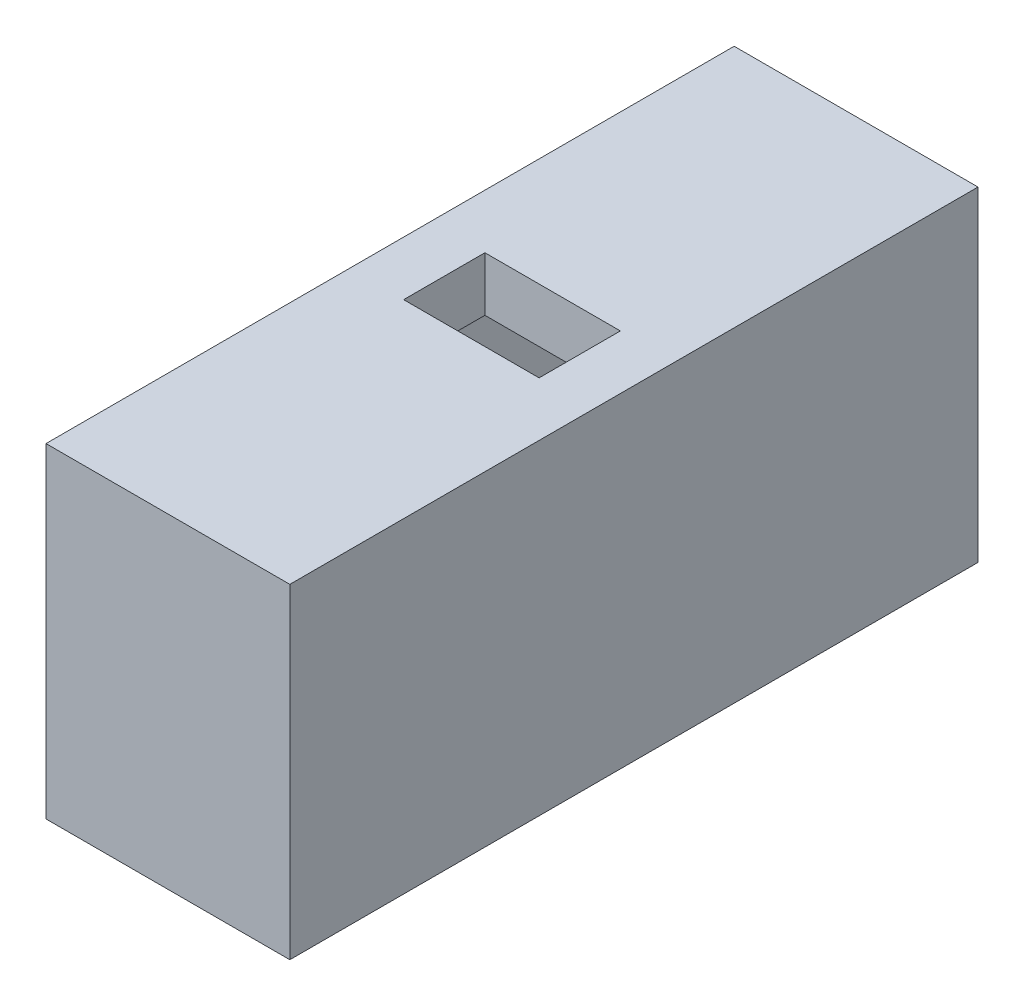
ISO-10303-21;
HEADER;
FILE_DESCRIPTION(('STEP AP214'),'2;1');
FILE_NAME('part.step','',(''),(''),'','','');
FILE_SCHEMA(('AUTOMOTIVE_DESIGN { 1 0 10303 214 1 1 1 1 }'));
ENDSEC;
DATA;
#1=APPLICATION_CONTEXT('core data for automotive mechanical design processes');
#2=APPLICATION_PROTOCOL_DEFINITION('international standard','automotive_design',2000,#1);
#3=PRODUCT_CONTEXT('',#1,'mechanical');
#4=PRODUCT('Part','Part','',(#3));
#5=PRODUCT_RELATED_PRODUCT_CATEGORY('part','',(#4));
#6=PRODUCT_DEFINITION_FORMATION('','',#4);
#7=PRODUCT_DEFINITION_CONTEXT('part definition',#1,'design');
#8=PRODUCT_DEFINITION('design','',#6,#7);
#9=PRODUCT_DEFINITION_SHAPE('','',#8);
#10=(LENGTH_UNIT() NAMED_UNIT(*) SI_UNIT(.MILLI.,.METRE.));
#11=(NAMED_UNIT(*) PLANE_ANGLE_UNIT() SI_UNIT($,.RADIAN.));
#12=(NAMED_UNIT(*) SI_UNIT($,.STERADIAN.) SOLID_ANGLE_UNIT());
#13=UNCERTAINTY_MEASURE_WITH_UNIT(LENGTH_MEASURE(1.E-05),#10,'distance_accuracy_value','');
#14=(GEOMETRIC_REPRESENTATION_CONTEXT(3) GLOBAL_UNCERTAINTY_ASSIGNED_CONTEXT((#13)) GLOBAL_UNIT_ASSIGNED_CONTEXT((#10,
#11,#12)) REPRESENTATION_CONTEXT('',''));
#15=CARTESIAN_POINT('',(0.,0.,0.));
#16=DIRECTION('',(0.,0.,1.));
#17=DIRECTION('',(1.,0.,0.));
#18=AXIS2_PLACEMENT_3D('',#15,#16,#17);
#19=CARTESIAN_POINT('',(-1.75,2.,-3.4));
#20=DIRECTION('',(0.,-1.,0.));
#21=DIRECTION('',(0.,0.,-1.));
#22=AXIS2_PLACEMENT_3D('',#19,#20,#21);
#23=PLANE('',#22);
#24=DIRECTION('',(1.,0.,0.));
#25=VECTOR('',#24,1.);
#26=CARTESIAN_POINT('',(-7.25,2.,-11.2));
#27=LINE('',#26,#25);
#28=CARTESIAN_POINT('',(-2.,2.,-11.2));
#29=VERTEX_POINT('',#28);
#30=CARTESIAN_POINT('',(-1.75,2.,-11.2));
#31=VERTEX_POINT('',#30);
#32=EDGE_CURVE('E172',#29,#31,#27,.T.);
#33=ORIENTED_EDGE('',*,*,#32,.T.);
#34=DIRECTION('',(0.,0.,-1.));
#35=VECTOR('',#34,1.);
#36=CARTESIAN_POINT('',(-1.75,2.,-3.4));
#37=LINE('',#36,#35);
#38=CARTESIAN_POINT('',(-1.75,2.,-25.4));
#39=VERTEX_POINT('',#38);
#40=EDGE_CURVE('E156',#31,#39,#37,.T.);
#41=ORIENTED_EDGE('',*,*,#40,.T.);
#42=DIRECTION('',(-1.,0.,0.));
#43=VECTOR('',#42,1.);
#44=CARTESIAN_POINT('',(-1.75,2.,-25.4));
#45=LINE('',#44,#43);
#46=CARTESIAN_POINT('',(-7.25,2.,-25.4));
#47=VERTEX_POINT('',#46);
#48=EDGE_CURVE('E208',#39,#47,#45,.T.);
#49=ORIENTED_EDGE('',*,*,#48,.T.);
#50=DIRECTION('',(0.,0.,-1.));
#51=VECTOR('',#50,1.);
#52=CARTESIAN_POINT('',(-7.25,2.,-3.4));
#53=LINE('',#52,#51);
#54=CARTESIAN_POINT('',(-7.25,2.,-11.2));
#55=VERTEX_POINT('',#54);
#56=EDGE_CURVE('E168',#55,#47,#53,.T.);
#57=ORIENTED_EDGE('',*,*,#56,.F.);
#58=CARTESIAN_POINT('',(-7.,2.,-11.2));
#59=VERTEX_POINT('',#58);
#60=EDGE_CURVE('E179',#55,#59,#27,.T.);
#61=ORIENTED_EDGE('',*,*,#60,.T.);
#62=DIRECTION('',(0.,0.,1.));
#63=VECTOR('',#62,1.);
#64=CARTESIAN_POINT('',(-7.,2.,-11.2));
#65=LINE('',#64,#63);
#66=CARTESIAN_POINT('',(-7.,2.,-14.2));
#67=VERTEX_POINT('',#66);
#68=EDGE_CURVE('E236',#67,#59,#65,.T.);
#69=ORIENTED_EDGE('',*,*,#68,.F.);
#70=DIRECTION('',(-1.,0.,0.));
#71=VECTOR('',#70,1.);
#72=CARTESIAN_POINT('',(-2.,2.,-14.2));
#73=LINE('',#72,#71);
#74=CARTESIAN_POINT('',(-2.,2.,-14.2));
#75=VERTEX_POINT('',#74);
#76=EDGE_CURVE('E232',#75,#67,#73,.T.);
#77=ORIENTED_EDGE('',*,*,#76,.F.);
#78=DIRECTION('',(0.,0.,-1.));
#79=VECTOR('',#78,1.);
#80=CARTESIAN_POINT('',(-2.,2.,-11.2));
#81=LINE('',#80,#79);
#82=EDGE_CURVE('E174',#29,#75,#81,.T.);
#83=ORIENTED_EDGE('',*,*,#82,.F.);
#84=EDGE_LOOP('',(#33,#41,#49,#57,#61,#69,#77,#83));
#85=FACE_BOUND('',#84,.T.);
#86=ADVANCED_FACE('F43',(#85),#23,.F.);
#87=CARTESIAN_POINT('',(-1.75,10.,-3.4));
#88=DIRECTION('',(0.,1.,0.));
#89=DIRECTION('',(0.,0.,1.));
#90=AXIS2_PLACEMENT_3D('',#87,#88,#89);
#91=PLANE('',#90);
#92=DIRECTION('',(-1.,0.,0.));
#93=VECTOR('',#92,1.);
#94=CARTESIAN_POINT('',(-7.25,10.,-11.2));
#95=LINE('',#94,#93);
#96=CARTESIAN_POINT('',(-7.,10.,-11.2));
#97=VERTEX_POINT('',#96);
#98=CARTESIAN_POINT('',(-7.25,10.,-11.2));
#99=VERTEX_POINT('',#98);
#100=EDGE_CURVE('E67',#97,#99,#95,.T.);
#101=ORIENTED_EDGE('',*,*,#100,.T.);
#102=DIRECTION('',(0.,0.,-1.));
#103=VECTOR('',#102,1.);
#104=CARTESIAN_POINT('',(-7.25,10.,-3.4));
#105=LINE('',#104,#103);
#106=CARTESIAN_POINT('',(-7.25,10.,-25.4));
#107=VERTEX_POINT('',#106);
#108=EDGE_CURVE('E211',#99,#107,#105,.T.);
#109=ORIENTED_EDGE('',*,*,#108,.T.);
#110=DIRECTION('',(1.,0.,0.));
#111=VECTOR('',#110,1.);
#112=CARTESIAN_POINT('',(-1.75,10.,-25.4));
#113=LINE('',#112,#111);
#114=CARTESIAN_POINT('',(-1.75,10.,-25.4));
#115=VERTEX_POINT('',#114);
#116=EDGE_CURVE('E202',#107,#115,#113,.T.);
#117=ORIENTED_EDGE('',*,*,#116,.T.);
#118=DIRECTION('',(0.,0.,-1.));
#119=VECTOR('',#118,1.);
#120=CARTESIAN_POINT('',(-1.75,10.,-3.4));
#121=LINE('',#120,#119);
#122=CARTESIAN_POINT('',(-1.75,10.,-11.2));
#123=VERTEX_POINT('',#122);
#124=EDGE_CURVE('E169',#123,#115,#121,.T.);
#125=ORIENTED_EDGE('',*,*,#124,.F.);
#126=CARTESIAN_POINT('',(-2.,10.,-11.2));
#127=VERTEX_POINT('',#126);
#128=EDGE_CURVE('E185',#123,#127,#95,.T.);
#129=ORIENTED_EDGE('',*,*,#128,.T.);
#130=DIRECTION('',(0.,0.,1.));
#131=VECTOR('',#130,1.);
#132=CARTESIAN_POINT('',(-2.,10.,-11.2));
#133=LINE('',#132,#131);
#134=CARTESIAN_POINT('',(-2.,10.,-14.2));
#135=VERTEX_POINT('',#134);
#136=EDGE_CURVE('E213',#135,#127,#133,.T.);
#137=ORIENTED_EDGE('',*,*,#136,.F.);
#138=DIRECTION('',(1.,0.,0.));
#139=VECTOR('',#138,1.);
#140=CARTESIAN_POINT('',(-2.,10.,-14.2));
#141=LINE('',#140,#139);
#142=CARTESIAN_POINT('',(-7.,10.,-14.2));
#143=VERTEX_POINT('',#142);
#144=EDGE_CURVE('E222',#143,#135,#141,.T.);
#145=ORIENTED_EDGE('',*,*,#144,.F.);
#146=DIRECTION('',(0.,0.,-1.));
#147=VECTOR('',#146,1.);
#148=CARTESIAN_POINT('',(-7.,10.,-11.2));
#149=LINE('',#148,#147);
#150=EDGE_CURVE('E226',#97,#143,#149,.T.);
#151=ORIENTED_EDGE('',*,*,#150,.F.);
#152=EDGE_LOOP('',(#101,#109,#117,#125,#129,#137,#145,#151));
#153=FACE_BOUND('',#152,.T.);
#154=ADVANCED_FACE('F365',(#153),#91,.F.);
#155=CARTESIAN_POINT('',(-7.25,10.,-3.4));
#156=DIRECTION('',(-1.,0.,0.));
#157=DIRECTION('',(0.,0.,1.));
#158=AXIS2_PLACEMENT_3D('',#155,#156,#157);
#159=PLANE('',#158);
#160=DIRECTION('',(0.,-1.,0.));
#161=VECTOR('',#160,1.);
#162=CARTESIAN_POINT('',(-7.25,2.,-11.2));
#163=LINE('',#162,#161);
#164=EDGE_CURVE('E59',#99,#55,#163,.T.);
#165=ORIENTED_EDGE('',*,*,#164,.T.);
#166=ORIENTED_EDGE('',*,*,#56,.T.);
#167=DIRECTION('',(0.,1.,0.));
#168=VECTOR('',#167,1.);
#169=CARTESIAN_POINT('',(-7.25,10.,-25.4));
#170=LINE('',#169,#168);
#171=EDGE_CURVE('E198',#47,#107,#170,.T.);
#172=ORIENTED_EDGE('',*,*,#171,.T.);
#173=ORIENTED_EDGE('',*,*,#108,.F.);
#174=EDGE_LOOP('',(#165,#166,#172,#173));
#175=FACE_BOUND('',#174,.T.);
#176=ADVANCED_FACE('F370',(#175),#159,.F.);
#177=CARTESIAN_POINT('',(-1.75,10.,-3.4));
#178=DIRECTION('',(1.,0.,0.));
#179=DIRECTION('',(0.,1.,0.));
#180=AXIS2_PLACEMENT_3D('',#177,#178,#179);
#181=PLANE('',#180);
#182=DIRECTION('',(0.,1.,0.));
#183=VECTOR('',#182,1.);
#184=CARTESIAN_POINT('',(-1.75,2.,-11.2));
#185=LINE('',#184,#183);
#186=EDGE_CURVE('E160',#31,#123,#185,.T.);
#187=ORIENTED_EDGE('',*,*,#186,.T.);
#188=ORIENTED_EDGE('',*,*,#124,.T.);
#189=DIRECTION('',(0.,-1.,0.));
#190=VECTOR('',#189,1.);
#191=CARTESIAN_POINT('',(-1.75,10.,-25.4));
#192=LINE('',#191,#190);
#193=EDGE_CURVE('E163',#115,#39,#192,.T.);
#194=ORIENTED_EDGE('',*,*,#193,.T.);
#195=ORIENTED_EDGE('',*,*,#40,.F.);
#196=EDGE_LOOP('',(#187,#188,#194,#195));
#197=FACE_BOUND('',#196,.T.);
#198=ADVANCED_FACE('F158',(#197),#181,.F.);
#199=CARTESIAN_POINT('',(-7.,0.,-11.2));
#200=DIRECTION('',(-1.,0.,0.));
#201=DIRECTION('',(0.,0.,1.));
#202=AXIS2_PLACEMENT_3D('',#199,#200,#201);
#203=PLANE('',#202);
#204=DIRECTION('',(0.,1.,0.));
#205=VECTOR('',#204,1.);
#206=CARTESIAN_POINT('',(-7.,0.,-14.2));
#207=LINE('',#206,#205);
#208=CARTESIAN_POINT('',(-7.,0.,-14.2));
#209=VERTEX_POINT('',#208);
#210=EDGE_CURVE('E273',#209,#67,#207,.T.);
#211=ORIENTED_EDGE('',*,*,#210,.T.);
#212=ORIENTED_EDGE('',*,*,#68,.T.);
#213=DIRECTION('',(0.,1.,0.));
#214=VECTOR('',#213,1.);
#215=CARTESIAN_POINT('',(-7.,0.,-11.2));
#216=LINE('',#215,#214);
#217=CARTESIAN_POINT('',(-7.,0.,-11.2));
#218=VERTEX_POINT('',#217);
#219=EDGE_CURVE('E288',#218,#59,#216,.T.);
#220=ORIENTED_EDGE('',*,*,#219,.F.);
#221=DIRECTION('',(0.,0.,1.));
#222=VECTOR('',#221,1.);
#223=CARTESIAN_POINT('',(-7.,0.,-11.2));
#224=LINE('',#223,#222);
#225=EDGE_CURVE('E241',#209,#218,#224,.T.);
#226=ORIENTED_EDGE('',*,*,#225,.F.);
#227=EDGE_LOOP('',(#211,#212,#220,#226));
#228=FACE_BOUND('',#227,.T.);
#229=ADVANCED_FACE('F377',(#228),#203,.F.);
#230=CARTESIAN_POINT('',(-2.,0.,-14.2));
#231=DIRECTION('',(0.,0.,-1.));
#232=DIRECTION('',(-1.,0.,0.));
#233=AXIS2_PLACEMENT_3D('',#230,#231,#232);
#234=PLANE('',#233);
#235=DIRECTION('',(0.,1.,0.));
#236=VECTOR('',#235,1.);
#237=CARTESIAN_POINT('',(-2.,0.,-14.2));
#238=LINE('',#237,#236);
#239=CARTESIAN_POINT('',(-2.,0.,-14.2));
#240=VERTEX_POINT('',#239);
#241=EDGE_CURVE('E279',#240,#75,#238,.T.);
#242=ORIENTED_EDGE('',*,*,#241,.T.);
#243=ORIENTED_EDGE('',*,*,#76,.T.);
#244=ORIENTED_EDGE('',*,*,#210,.F.);
#245=DIRECTION('',(-1.,0.,0.));
#246=VECTOR('',#245,1.);
#247=CARTESIAN_POINT('',(-2.,0.,-14.2));
#248=LINE('',#247,#246);
#249=EDGE_CURVE('E254',#240,#209,#248,.T.);
#250=ORIENTED_EDGE('',*,*,#249,.F.);
#251=EDGE_LOOP('',(#242,#243,#244,#250));
#252=FACE_BOUND('',#251,.T.);
#253=ADVANCED_FACE('F386',(#252),#234,.F.);
#254=CARTESIAN_POINT('',(-2.,0.,-11.2));
#255=DIRECTION('',(1.,0.,0.));
#256=DIRECTION('',(0.,0.,-1.));
#257=AXIS2_PLACEMENT_3D('',#254,#255,#256);
#258=PLANE('',#257);
#259=DIRECTION('',(0.,1.,0.));
#260=VECTOR('',#259,1.);
#261=CARTESIAN_POINT('',(-2.,0.,-11.2));
#262=LINE('',#261,#260);
#263=CARTESIAN_POINT('',(-2.,0.,-11.2));
#264=VERTEX_POINT('',#263);
#265=EDGE_CURVE('E284',#264,#29,#262,.T.);
#266=ORIENTED_EDGE('',*,*,#265,.T.);
#267=ORIENTED_EDGE('',*,*,#82,.T.);
#268=ORIENTED_EDGE('',*,*,#241,.F.);
#269=DIRECTION('',(0.,0.,-1.));
#270=VECTOR('',#269,1.);
#271=CARTESIAN_POINT('',(-2.,0.,-11.2));
#272=LINE('',#271,#270);
#273=EDGE_CURVE('E250',#264,#240,#272,.T.);
#274=ORIENTED_EDGE('',*,*,#273,.F.);
#275=EDGE_LOOP('',(#266,#267,#268,#274));
#276=FACE_BOUND('',#275,.T.);
#277=ADVANCED_FACE('F390',(#276),#258,.F.);
#278=CARTESIAN_POINT('',(0.,12.,0.));
#279=DIRECTION('',(-1.,0.,0.));
#280=DIRECTION('',(0.,0.,1.));
#281=AXIS2_PLACEMENT_3D('',#278,#279,#280);
#282=PLANE('',#281);
#283=DIRECTION('',(0.,0.,-1.));
#284=VECTOR('',#283,1.);
#285=CARTESIAN_POINT('',(0.,0.,0.));
#286=LINE('',#285,#284);
#287=CARTESIAN_POINT('',(0.,0.,0.));
#288=VERTEX_POINT('',#287);
#289=CARTESIAN_POINT('',(0.,0.,-25.4));
#290=VERTEX_POINT('',#289);
#291=EDGE_CURVE('E277',#288,#290,#286,.T.);
#292=ORIENTED_EDGE('',*,*,#291,.T.);
#293=DIRECTION('',(0.,-1.,0.));
#294=VECTOR('',#293,1.);
#295=CARTESIAN_POINT('',(0.,12.,-25.4));
#296=LINE('',#295,#294);
#297=CARTESIAN_POINT('',(0.,12.,-25.4));
#298=VERTEX_POINT('',#297);
#299=EDGE_CURVE('E52',#298,#290,#296,.T.);
#300=ORIENTED_EDGE('',*,*,#299,.F.);
#301=DIRECTION('',(0.,0.,-1.));
#302=VECTOR('',#301,1.);
#303=CARTESIAN_POINT('',(0.,12.,0.));
#304=LINE('',#303,#302);
#305=CARTESIAN_POINT('',(0.,12.,0.));
#306=VERTEX_POINT('',#305);
#307=EDGE_CURVE('E292',#306,#298,#304,.T.);
#308=ORIENTED_EDGE('',*,*,#307,.F.);
#309=DIRECTION('',(0.,-1.,0.));
#310=VECTOR('',#309,1.);
#311=CARTESIAN_POINT('',(0.,12.,0.));
#312=LINE('',#311,#310);
#313=EDGE_CURVE('E306',#306,#288,#312,.T.);
#314=ORIENTED_EDGE('',*,*,#313,.T.);
#315=EDGE_LOOP('',(#292,#300,#308,#314));
#316=FACE_BOUND('',#315,.T.);
#317=ADVANCED_FACE('F45',(#316),#282,.F.);
#318=CARTESIAN_POINT('',(0.,12.,-25.4));
#319=DIRECTION('',(0.,0.,1.));
#320=DIRECTION('',(1.,0.,0.));
#321=AXIS2_PLACEMENT_3D('',#318,#319,#320);
#322=PLANE('',#321);
#323=ORIENTED_EDGE('',*,*,#116,.F.);
#324=ORIENTED_EDGE('',*,*,#171,.F.);
#325=ORIENTED_EDGE('',*,*,#48,.F.);
#326=ORIENTED_EDGE('',*,*,#193,.F.);
#327=EDGE_LOOP('',(#323,#324,#325,#326));
#328=FACE_BOUND('',#327,.T.);
#329=DIRECTION('',(-1.,0.,0.));
#330=VECTOR('',#329,1.);
#331=CARTESIAN_POINT('',(0.,0.,-25.4));
#332=LINE('',#331,#330);
#333=CARTESIAN_POINT('',(-9.,0.,-25.4));
#334=VERTEX_POINT('',#333);
#335=EDGE_CURVE('E310',#290,#334,#332,.T.);
#336=ORIENTED_EDGE('',*,*,#335,.T.);
#337=DIRECTION('',(0.,-1.,0.));
#338=VECTOR('',#337,1.);
#339=CARTESIAN_POINT('',(-9.,12.,-25.4));
#340=LINE('',#339,#338);
#341=CARTESIAN_POINT('',(-9.,12.,-25.4));
#342=VERTEX_POINT('',#341);
#343=EDGE_CURVE('E325',#342,#334,#340,.T.);
#344=ORIENTED_EDGE('',*,*,#343,.F.);
#345=DIRECTION('',(-1.,0.,0.));
#346=VECTOR('',#345,1.);
#347=CARTESIAN_POINT('',(0.,12.,-25.4));
#348=LINE('',#347,#346);
#349=EDGE_CURVE('E296',#298,#342,#348,.T.);
#350=ORIENTED_EDGE('',*,*,#349,.F.);
#351=ORIENTED_EDGE('',*,*,#299,.T.);
#352=EDGE_LOOP('',(#336,#344,#350,#351));
#353=FACE_BOUND('',#352,.T.);
#354=ADVANCED_FACE('F332',(#328,#353),#322,.F.);
#355=CARTESIAN_POINT('',(-9.,12.,0.));
#356=DIRECTION('',(1.,0.,0.));
#357=DIRECTION('',(0.,0.,-1.));
#358=AXIS2_PLACEMENT_3D('',#355,#356,#357);
#359=PLANE('',#358);
#360=DIRECTION('',(0.,0.,1.));
#361=VECTOR('',#360,1.);
#362=CARTESIAN_POINT('',(-9.,0.,0.));
#363=LINE('',#362,#361);
#364=CARTESIAN_POINT('',(-9.,0.,0.));
#365=VERTEX_POINT('',#364);
#366=EDGE_CURVE('E313',#334,#365,#363,.T.);
#367=ORIENTED_EDGE('',*,*,#366,.T.);
#368=DIRECTION('',(0.,-1.,0.));
#369=VECTOR('',#368,1.);
#370=CARTESIAN_POINT('',(-9.,12.,0.));
#371=LINE('',#370,#369);
#372=CARTESIAN_POINT('',(-9.,12.,0.));
#373=VERTEX_POINT('',#372);
#374=EDGE_CURVE('E321',#373,#365,#371,.T.);
#375=ORIENTED_EDGE('',*,*,#374,.F.);
#376=DIRECTION('',(0.,0.,1.));
#377=VECTOR('',#376,1.);
#378=CARTESIAN_POINT('',(-9.,12.,0.));
#379=LINE('',#378,#377);
#380=EDGE_CURVE('E300',#342,#373,#379,.T.);
#381=ORIENTED_EDGE('',*,*,#380,.F.);
#382=ORIENTED_EDGE('',*,*,#343,.T.);
#383=EDGE_LOOP('',(#367,#375,#381,#382));
#384=FACE_BOUND('',#383,.T.);
#385=ADVANCED_FACE('F344',(#384),#359,.F.);
#386=CARTESIAN_POINT('',(0.,12.,0.));
#387=DIRECTION('',(0.,0.,-1.));
#388=DIRECTION('',(-1.,0.,0.));
#389=AXIS2_PLACEMENT_3D('',#386,#387,#388);
#390=PLANE('',#389);
#391=DIRECTION('',(1.,0.,0.));
#392=VECTOR('',#391,1.);
#393=CARTESIAN_POINT('',(0.,0.,0.));
#394=LINE('',#393,#392);
#395=EDGE_CURVE('E297',#365,#288,#394,.T.);
#396=ORIENTED_EDGE('',*,*,#395,.T.);
#397=ORIENTED_EDGE('',*,*,#313,.F.);
#398=DIRECTION('',(1.,0.,0.));
#399=VECTOR('',#398,1.);
#400=CARTESIAN_POINT('',(0.,12.,0.));
#401=LINE('',#400,#399);
#402=EDGE_CURVE('E303',#373,#306,#401,.T.);
#403=ORIENTED_EDGE('',*,*,#402,.F.);
#404=ORIENTED_EDGE('',*,*,#374,.T.);
#405=EDGE_LOOP('',(#396,#397,#403,#404));
#406=FACE_BOUND('',#405,.T.);
#407=ADVANCED_FACE('F348',(#406),#390,.F.);
#408=CARTESIAN_POINT('',(0.,12.,0.));
#409=DIRECTION('',(0.,1.,0.));
#410=DIRECTION('',(0.,0.,1.));
#411=AXIS2_PLACEMENT_3D('',#408,#409,#410);
#412=PLANE('',#411);
#413=DIRECTION('',(0.,0.,1.));
#414=VECTOR('',#413,1.);
#415=CARTESIAN_POINT('',(-7.,12.,-11.2));
#416=LINE('',#415,#414);
#417=CARTESIAN_POINT('',(-7.,12.,-14.2));
#418=VERTEX_POINT('',#417);
#419=CARTESIAN_POINT('',(-7.,12.,-11.2));
#420=VERTEX_POINT('',#419);
#421=EDGE_CURVE('E240',#418,#420,#416,.T.);
#422=ORIENTED_EDGE('',*,*,#421,.F.);
#423=DIRECTION('',(-1.,0.,0.));
#424=VECTOR('',#423,1.);
#425=CARTESIAN_POINT('',(-2.,12.,-14.2));
#426=LINE('',#425,#424);
#427=CARTESIAN_POINT('',(-2.,12.,-14.2));
#428=VERTEX_POINT('',#427);
#429=EDGE_CURVE('E246',#428,#418,#426,.T.);
#430=ORIENTED_EDGE('',*,*,#429,.F.);
#431=DIRECTION('',(0.,0.,-1.));
#432=VECTOR('',#431,1.);
#433=CARTESIAN_POINT('',(-2.,12.,-11.2));
#434=LINE('',#433,#432);
#435=CARTESIAN_POINT('',(-2.,12.,-11.2));
#436=VERTEX_POINT('',#435);
#437=EDGE_CURVE('E266',#436,#428,#434,.T.);
#438=ORIENTED_EDGE('',*,*,#437,.F.);
#439=DIRECTION('',(1.,0.,0.));
#440=VECTOR('',#439,1.);
#441=CARTESIAN_POINT('',(-2.,12.,-11.2));
#442=LINE('',#441,#440);
#443=EDGE_CURVE('E262',#420,#436,#442,.T.);
#444=ORIENTED_EDGE('',*,*,#443,.F.);
#445=EDGE_LOOP('',(#422,#430,#438,#444));
#446=FACE_BOUND('',#445,.T.);
#447=ORIENTED_EDGE('',*,*,#307,.T.);
#448=ORIENTED_EDGE('',*,*,#349,.T.);
#449=ORIENTED_EDGE('',*,*,#380,.T.);
#450=ORIENTED_EDGE('',*,*,#402,.T.);
#451=EDGE_LOOP('',(#447,#448,#449,#450));
#452=FACE_BOUND('',#451,.T.);
#453=ADVANCED_FACE('F350',(#446,#452),#412,.T.);
#454=CARTESIAN_POINT('',(0.,0.,0.));
#455=DIRECTION('',(0.,1.,0.));
#456=DIRECTION('',(0.,0.,1.));
#457=AXIS2_PLACEMENT_3D('',#454,#455,#456);
#458=PLANE('',#457);
#459=ORIENTED_EDGE('',*,*,#249,.T.);
#460=ORIENTED_EDGE('',*,*,#225,.T.);
#461=DIRECTION('',(1.,0.,0.));
#462=VECTOR('',#461,1.);
#463=CARTESIAN_POINT('',(-2.,0.,-11.2));
#464=LINE('',#463,#462);
#465=EDGE_CURVE('E245',#218,#264,#464,.T.);
#466=ORIENTED_EDGE('',*,*,#465,.T.);
#467=ORIENTED_EDGE('',*,*,#273,.T.);
#468=EDGE_LOOP('',(#459,#460,#466,#467));
#469=FACE_BOUND('',#468,.T.);
#470=ORIENTED_EDGE('',*,*,#291,.F.);
#471=ORIENTED_EDGE('',*,*,#395,.F.);
#472=ORIENTED_EDGE('',*,*,#366,.F.);
#473=ORIENTED_EDGE('',*,*,#335,.F.);
#474=EDGE_LOOP('',(#470,#471,#472,#473));
#475=FACE_BOUND('',#474,.T.);
#476=ADVANCED_FACE('F340',(#469,#475),#458,.F.);
#477=EDGE_CURVE('E258',#97,#420,#216,.T.);
#478=ORIENTED_EDGE('',*,*,#477,.F.);
#479=ORIENTED_EDGE('',*,*,#150,.T.);
#480=EDGE_CURVE('E278',#143,#418,#207,.T.);
#481=ORIENTED_EDGE('',*,*,#480,.T.);
#482=ORIENTED_EDGE('',*,*,#421,.T.);
#483=EDGE_LOOP('',(#478,#479,#481,#482));
#484=FACE_BOUND('',#483,.T.);
#485=ADVANCED_FACE('F358',(#484),#203,.F.);
#486=ORIENTED_EDGE('',*,*,#480,.F.);
#487=ORIENTED_EDGE('',*,*,#144,.T.);
#488=EDGE_CURVE('E283',#135,#428,#238,.T.);
#489=ORIENTED_EDGE('',*,*,#488,.T.);
#490=ORIENTED_EDGE('',*,*,#429,.T.);
#491=EDGE_LOOP('',(#486,#487,#489,#490));
#492=FACE_BOUND('',#491,.T.);
#493=ADVANCED_FACE('F381',(#492),#234,.F.);
#494=ORIENTED_EDGE('',*,*,#488,.F.);
#495=ORIENTED_EDGE('',*,*,#136,.T.);
#496=EDGE_CURVE('E287',#127,#436,#262,.T.);
#497=ORIENTED_EDGE('',*,*,#496,.T.);
#498=ORIENTED_EDGE('',*,*,#437,.T.);
#499=EDGE_LOOP('',(#494,#495,#497,#498));
#500=FACE_BOUND('',#499,.T.);
#501=ADVANCED_FACE('F384',(#500),#258,.F.);
#502=CARTESIAN_POINT('',(-2.,0.,-11.2));
#503=DIRECTION('',(0.,0.,1.));
#504=DIRECTION('',(1.,0.,0.));
#505=AXIS2_PLACEMENT_3D('',#502,#503,#504);
#506=PLANE('',#505);
#507=ORIENTED_EDGE('',*,*,#496,.F.);
#508=ORIENTED_EDGE('',*,*,#128,.F.);
#509=ORIENTED_EDGE('',*,*,#186,.F.);
#510=ORIENTED_EDGE('',*,*,#32,.F.);
#511=ORIENTED_EDGE('',*,*,#265,.F.);
#512=ORIENTED_EDGE('',*,*,#465,.F.);
#513=ORIENTED_EDGE('',*,*,#219,.T.);
#514=ORIENTED_EDGE('',*,*,#60,.F.);
#515=ORIENTED_EDGE('',*,*,#164,.F.);
#516=ORIENTED_EDGE('',*,*,#100,.F.);
#517=ORIENTED_EDGE('',*,*,#477,.T.);
#518=ORIENTED_EDGE('',*,*,#443,.T.);
#519=EDGE_LOOP('',(#507,#508,#509,#510,#511,#512,#513,#514,#515,#516,#517,#518));
#520=FACE_BOUND('',#519,.T.);
#521=CARTESIAN_POINT('',(-4.5,6.,-11.2));
#522=DIRECTION('',(0.,0.,1.));
#523=DIRECTION('',(1.,0.,0.));
#524=AXIS2_PLACEMENT_3D('',#521,#522,#523);
#525=CIRCLE('',#524,2.235);
#526=CARTESIAN_POINT('',(-2.265,6.,-11.2));
#527=VERTEX_POINT('',#526);
#528=EDGE_CURVE('E194',#527,#527,#525,.T.);
#529=ORIENTED_EDGE('',*,*,#528,.T.);
#530=EDGE_LOOP('',(#529));
#531=FACE_BOUND('',#530,.T.);
#532=ADVANCED_FACE('F183',(#520,#531),#506,.F.);
#533=CARTESIAN_POINT('',(-4.5,6.,-20.9082439194738));
#534=DIRECTION('',(0.,0.,1.));
#535=DIRECTION('',(1.,0.,0.));
#536=AXIS2_PLACEMENT_3D('',#533,#534,#535);
#537=CYLINDRICAL_SURFACE('',#536,2.235);
#538=CARTESIAN_POINT('',(-4.5,6.,-6.8162));
#539=DIRECTION('',(0.,0.,-1.));
#540=DIRECTION('',(-1.,0.,0.));
#541=AXIS2_PLACEMENT_3D('',#538,#539,#540);
#542=CIRCLE('',#541,2.235);
#543=CARTESIAN_POINT('',(-2.265,6.,-6.8162));
#544=VERTEX_POINT('',#543);
#545=EDGE_CURVE('E11',#544,#544,#542,.T.);
#546=CARTESIAN_POINT('',(-2.265,6.,-6.8162));
#547=CARTESIAN_POINT('',(-2.265,6.,-6.86186458333333));
#548=CARTESIAN_POINT('',(-2.265,6.,-6.90752916666667));
#549=CARTESIAN_POINT('',(-2.265,6.,-6.99885833333333));
#550=CARTESIAN_POINT('',(-2.265,6.,-7.04452291666667));
#551=CARTESIAN_POINT('',(-2.265,6.,-7.13585208333333));
#552=CARTESIAN_POINT('',(-2.265,6.,-7.18151666666667));
#553=CARTESIAN_POINT('',(-2.265,6.,-7.27284583333333));
#554=CARTESIAN_POINT('',(-2.265,6.,-7.31851041666667));
#555=CARTESIAN_POINT('',(-2.265,6.,-7.40983958333333));
#556=CARTESIAN_POINT('',(-2.265,6.,-7.45550416666667));
#557=CARTESIAN_POINT('',(-2.265,6.,-7.54683333333333));
#558=CARTESIAN_POINT('',(-2.265,6.,-7.59249791666667));
#559=CARTESIAN_POINT('',(-2.265,6.,-7.68382708333333));
#560=CARTESIAN_POINT('',(-2.265,6.,-7.72949166666667));
#561=CARTESIAN_POINT('',(-2.265,6.,-7.82082083333333));
#562=CARTESIAN_POINT('',(-2.265,6.,-7.86648541666667));
#563=CARTESIAN_POINT('',(-2.265,6.,-7.95781458333333));
#564=CARTESIAN_POINT('',(-2.265,6.,-8.00347916666666));
#565=CARTESIAN_POINT('',(-2.265,6.,-8.09480833333333));
#566=CARTESIAN_POINT('',(-2.265,6.,-8.14047291666667));
#567=CARTESIAN_POINT('',(-2.265,6.,-8.23180208333333));
#568=CARTESIAN_POINT('',(-2.265,6.,-8.27746666666667));
#569=CARTESIAN_POINT('',(-2.265,6.,-8.36879583333333));
#570=CARTESIAN_POINT('',(-2.265,6.,-8.41446041666667));
#571=CARTESIAN_POINT('',(-2.265,6.,-8.50578958333333));
#572=CARTESIAN_POINT('',(-2.265,6.,-8.55145416666667));
#573=CARTESIAN_POINT('',(-2.265,6.,-8.64278333333333));
#574=CARTESIAN_POINT('',(-2.265,6.,-8.68844791666667));
#575=CARTESIAN_POINT('',(-2.265,6.,-8.77977708333333));
#576=CARTESIAN_POINT('',(-2.265,6.,-8.82544166666667));
#577=CARTESIAN_POINT('',(-2.265,6.,-8.91677083333333));
#578=CARTESIAN_POINT('',(-2.265,6.,-8.96243541666667));
#579=CARTESIAN_POINT('',(-2.265,6.,-9.05376458333333));
#580=CARTESIAN_POINT('',(-2.265,6.,-9.09942916666667));
#581=CARTESIAN_POINT('',(-2.265,6.,-9.19075833333333));
#582=CARTESIAN_POINT('',(-2.265,6.,-9.23642291666667));
#583=CARTESIAN_POINT('',(-2.265,6.,-9.32775208333333));
#584=CARTESIAN_POINT('',(-2.265,6.,-9.37341666666667));
#585=CARTESIAN_POINT('',(-2.265,6.,-9.46474583333333));
#586=CARTESIAN_POINT('',(-2.265,6.,-9.51041041666667));
#587=CARTESIAN_POINT('',(-2.265,6.,-9.60173958333333));
#588=CARTESIAN_POINT('',(-2.265,6.,-9.64740416666667));
#589=CARTESIAN_POINT('',(-2.265,6.,-9.73873333333333));
#590=CARTESIAN_POINT('',(-2.265,6.,-9.78439791666667));
#591=CARTESIAN_POINT('',(-2.265,6.,-9.87572708333333));
#592=CARTESIAN_POINT('',(-2.265,6.,-9.92139166666667));
#593=CARTESIAN_POINT('',(-2.265,6.,-10.0127208333333));
#594=CARTESIAN_POINT('',(-2.265,6.,-10.0583854166667));
#595=CARTESIAN_POINT('',(-2.265,6.,-10.1497145833333));
#596=CARTESIAN_POINT('',(-2.265,6.,-10.1953791666667));
#597=CARTESIAN_POINT('',(-2.265,6.,-10.2867083333333));
#598=CARTESIAN_POINT('',(-2.265,6.,-10.3323729166667));
#599=CARTESIAN_POINT('',(-2.265,6.,-10.4237020833333));
#600=CARTESIAN_POINT('',(-2.265,6.,-10.4693666666667));
#601=CARTESIAN_POINT('',(-2.265,6.,-10.5606958333333));
#602=CARTESIAN_POINT('',(-2.265,6.,-10.6063604166667));
#603=CARTESIAN_POINT('',(-2.265,6.,-10.6976895833333));
#604=CARTESIAN_POINT('',(-2.265,6.,-10.7433541666667));
#605=CARTESIAN_POINT('',(-2.265,6.,-10.8346833333333));
#606=CARTESIAN_POINT('',(-2.265,6.,-10.8803479166667));
#607=CARTESIAN_POINT('',(-2.265,6.,-10.9716770833333));
#608=CARTESIAN_POINT('',(-2.265,6.,-11.0173416666667));
#609=CARTESIAN_POINT('',(-2.265,6.,-11.1086708333333));
#610=CARTESIAN_POINT('',(-2.265,6.,-11.1543354166667));
#611=CARTESIAN_POINT('',(-2.265,6.,-11.2));
#612=B_SPLINE_CURVE_WITH_KNOTS('',3,(#546,#547,#548,#549,#550,#551,#552,#553,#554,#555,#556,
#557,#558,#559,#560,#561,#562,#563,#564,#565,#566,#567,#568,#569,#570,#571,#572,#573,#574,#575,
#576,#577,#578,#579,#580,#581,#582,#583,#584,#585,#586,#587,#588,#589,#590,#591,#592,#593,#594,
#595,#596,#597,#598,#599,#600,#601,#602,#603,#604,#605,#606,#607,#608,#609,#610,#611),
.UNSPECIFIED.,.F.,.F.,(4,2,2,2,2,2,2,2,2,2,2,2,2,2,2,2,2,2,2,2,2,2,2,2,2,2,2,2,2,2,2,2,4),(0.,
0.13699375,0.2739875,0.410981249999999,0.547974999999999,0.684968750000001,0.8219625,0.95895625,
1.09595,1.23294375,1.3699375,1.50693125,1.643925,1.78091875,1.9179125,2.05490625,2.1919,
2.32889375,2.4658875,2.60288125,2.739875,2.87686875,3.0138625,3.15085625,3.28785,3.42484375,
3.5618375,3.69883125,3.835825,3.97281875,4.1098125,4.24680625,4.3838),.UNSPECIFIED.);
#613=EDGE_CURVE('BSEAM374',#544,#527,#612,.T.);
#614=ORIENTED_EDGE('',*,*,#545,.F.);
#615=ORIENTED_EDGE('',*,*,#528,.F.);
#616=ORIENTED_EDGE('',*,*,#613,.T.);
#617=ORIENTED_EDGE('',*,*,#613,.F.);
#618=EDGE_LOOP('',(#614,#616,#615,#617));
#619=FACE_BOUND('',#618,.T.);
#620=ADVANCED_FACE('F374',(#619),#537,.F.);
#621=CARTESIAN_POINT('',(-4.5,6.,-6.8162));
#622=DIRECTION('',(0.,0.,-1.));
#623=DIRECTION('',(-1.,0.,0.));
#624=AXIS2_PLACEMENT_3D('',#621,#622,#623);
#625=PLANE('',#624);
#626=ORIENTED_EDGE('',*,*,#545,.T.);
#627=EDGE_LOOP('',(#626));
#628=FACE_BOUND('',#627,.T.);
#629=ADVANCED_FACE('F515',(#628),#625,.T.);
#630=CLOSED_SHELL('',(#86,#154,#176,#198,#229,#253,#277,#317,#354,#385,#407,#453,#476,#485,#493,
#501,#532,#620,#629));
#631=MANIFOLD_SOLID_BREP('B2',#630);
#632=ADVANCED_BREP_SHAPE_REPRESENTATION('',(#18,#631),#14);
#633=SHAPE_DEFINITION_REPRESENTATION(#9,#632);
ENDSEC;
END-ISO-10303-21;
